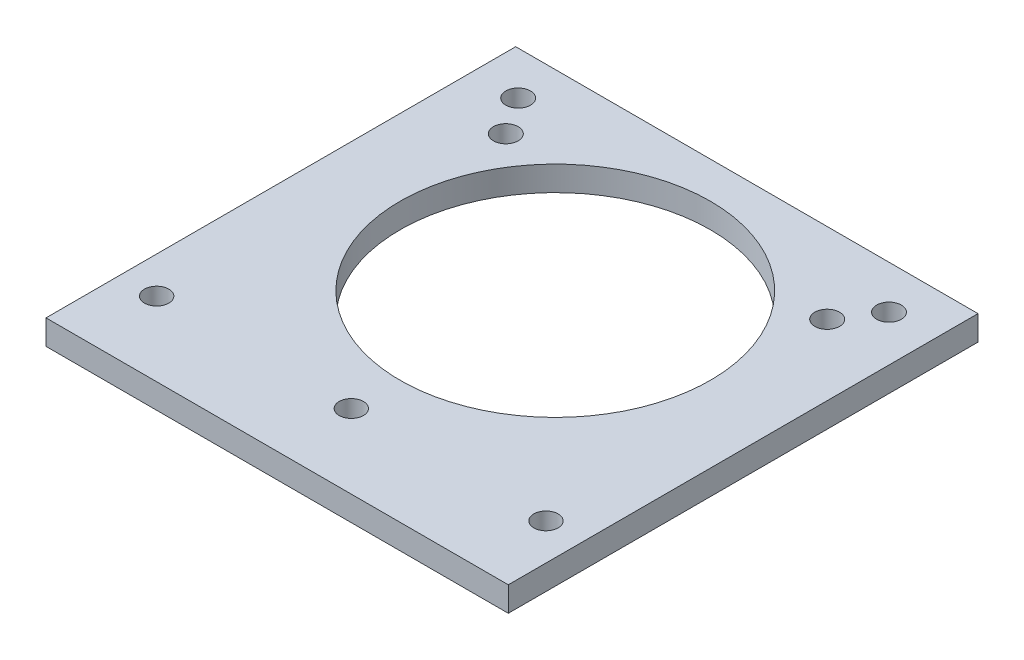
ISO-10303-21;
HEADER;
FILE_DESCRIPTION(('STEP AP214'),'2;1');
FILE_NAME('part.step','',(''),(''),'','','');
FILE_SCHEMA(('AUTOMOTIVE_DESIGN { 1 0 10303 214 1 1 1 1 }'));
ENDSEC;
DATA;
#1=APPLICATION_CONTEXT('core data for automotive mechanical design processes');
#2=APPLICATION_PROTOCOL_DEFINITION('international standard','automotive_design',2000,#1);
#3=PRODUCT_CONTEXT('',#1,'mechanical');
#4=PRODUCT('Part','Part','',(#3));
#5=PRODUCT_RELATED_PRODUCT_CATEGORY('part','',(#4));
#6=PRODUCT_DEFINITION_FORMATION('','',#4);
#7=PRODUCT_DEFINITION_CONTEXT('part definition',#1,'design');
#8=PRODUCT_DEFINITION('design','',#6,#7);
#9=PRODUCT_DEFINITION_SHAPE('','',#8);
#10=(LENGTH_UNIT() NAMED_UNIT(*) SI_UNIT(.MILLI.,.METRE.));
#11=(NAMED_UNIT(*) PLANE_ANGLE_UNIT() SI_UNIT($,.RADIAN.));
#12=(NAMED_UNIT(*) SI_UNIT($,.STERADIAN.) SOLID_ANGLE_UNIT());
#13=UNCERTAINTY_MEASURE_WITH_UNIT(LENGTH_MEASURE(1.E-05),#10,'distance_accuracy_value','');
#14=(GEOMETRIC_REPRESENTATION_CONTEXT(3) GLOBAL_UNCERTAINTY_ASSIGNED_CONTEXT((#13)) GLOBAL_UNIT_ASSIGNED_CONTEXT((#10,
#11,#12)) REPRESENTATION_CONTEXT('',''));
#15=CARTESIAN_POINT('',(0.,0.,0.));
#16=DIRECTION('',(0.,0.,1.));
#17=DIRECTION('',(1.,0.,0.));
#18=AXIS2_PLACEMENT_3D('',#15,#16,#17);
#19=CARTESIAN_POINT('',(-47.5,5.08,35.56));
#20=DIRECTION('',(0.,0.,-1.));
#21=DIRECTION('',(1.,0.,0.));
#22=AXIS2_PLACEMENT_3D('',#19,#20,#21);
#23=PLANE('',#22);
#24=DIRECTION('',(-1.,0.,0.));
#25=VECTOR('',#24,1.);
#26=CARTESIAN_POINT('',(-47.5,0.,35.56));
#27=LINE('',#26,#25);
#28=CARTESIAN_POINT('',(47.5,0.,35.56));
#29=VERTEX_POINT('',#28);
#30=CARTESIAN_POINT('',(-47.5,0.,35.56));
#31=VERTEX_POINT('',#30);
#32=EDGE_CURVE('E110',#29,#31,#27,.T.);
#33=ORIENTED_EDGE('',*,*,#32,.F.);
#34=DIRECTION('',(0.,-1.,0.));
#35=VECTOR('',#34,1.);
#36=CARTESIAN_POINT('',(47.5,5.08,35.56));
#37=LINE('',#36,#35);
#38=CARTESIAN_POINT('',(47.5,5.08,35.56));
#39=VERTEX_POINT('',#38);
#40=EDGE_CURVE('E109',#39,#29,#37,.T.);
#41=ORIENTED_EDGE('',*,*,#40,.F.);
#42=DIRECTION('',(-1.,0.,0.));
#43=VECTOR('',#42,1.);
#44=CARTESIAN_POINT('',(-47.5,5.08,35.56));
#45=LINE('',#44,#43);
#46=CARTESIAN_POINT('',(-47.5,5.08,35.56));
#47=VERTEX_POINT('',#46);
#48=EDGE_CURVE('E103',#39,#47,#45,.T.);
#49=ORIENTED_EDGE('',*,*,#48,.T.);
#50=DIRECTION('',(0.,-1.,0.));
#51=VECTOR('',#50,1.);
#52=CARTESIAN_POINT('',(-47.5,5.08,35.56));
#53=LINE('',#52,#51);
#54=EDGE_CURVE('E11',#47,#31,#53,.T.);
#55=ORIENTED_EDGE('',*,*,#54,.T.);
#56=EDGE_LOOP('',(#33,#41,#49,#55));
#57=FACE_BOUND('',#56,.T.);
#58=ADVANCED_FACE('F43',(#57),#23,.F.);
#59=CARTESIAN_POINT('',(-47.5,5.08,-60.96));
#60=DIRECTION('',(1.,0.,0.));
#61=DIRECTION('',(0.,0.,1.));
#62=AXIS2_PLACEMENT_3D('',#59,#60,#61);
#63=PLANE('',#62);
#64=DIRECTION('',(0.,0.,-1.));
#65=VECTOR('',#64,1.);
#66=CARTESIAN_POINT('',(-47.5,0.,-60.96));
#67=LINE('',#66,#65);
#68=CARTESIAN_POINT('',(-47.5,0.,-60.96));
#69=VERTEX_POINT('',#68);
#70=EDGE_CURVE('E112',#31,#69,#67,.T.);
#71=ORIENTED_EDGE('',*,*,#70,.F.);
#72=ORIENTED_EDGE('',*,*,#54,.F.);
#73=DIRECTION('',(0.,0.,-1.));
#74=VECTOR('',#73,1.);
#75=CARTESIAN_POINT('',(-47.5,5.08,-60.96));
#76=LINE('',#75,#74);
#77=CARTESIAN_POINT('',(-47.5,5.08,-60.96));
#78=VERTEX_POINT('',#77);
#79=EDGE_CURVE('E86',#47,#78,#76,.T.);
#80=ORIENTED_EDGE('',*,*,#79,.T.);
#81=DIRECTION('',(0.,-1.,0.));
#82=VECTOR('',#81,1.);
#83=CARTESIAN_POINT('',(-47.5,5.08,-60.96));
#84=LINE('',#83,#82);
#85=EDGE_CURVE('E52',#78,#69,#84,.T.);
#86=ORIENTED_EDGE('',*,*,#85,.T.);
#87=EDGE_LOOP('',(#71,#72,#80,#86));
#88=FACE_BOUND('',#87,.T.);
#89=ADVANCED_FACE('F101',(#88),#63,.F.);
#90=CARTESIAN_POINT('',(-47.5,5.08,-60.96));
#91=DIRECTION('',(0.,0.,1.));
#92=DIRECTION('',(-1.,0.,0.));
#93=AXIS2_PLACEMENT_3D('',#90,#91,#92);
#94=PLANE('',#93);
#95=DIRECTION('',(1.,0.,0.));
#96=VECTOR('',#95,1.);
#97=CARTESIAN_POINT('',(-47.5,0.,-60.96));
#98=LINE('',#97,#96);
#99=CARTESIAN_POINT('',(47.5,0.,-60.96));
#100=VERTEX_POINT('',#99);
#101=EDGE_CURVE('E96',#69,#100,#98,.T.);
#102=ORIENTED_EDGE('',*,*,#101,.F.);
#103=ORIENTED_EDGE('',*,*,#85,.F.);
#104=DIRECTION('',(1.,0.,0.));
#105=VECTOR('',#104,1.);
#106=CARTESIAN_POINT('',(-47.5,5.08,-60.96));
#107=LINE('',#106,#105);
#108=CARTESIAN_POINT('',(47.5,5.08,-60.96));
#109=VERTEX_POINT('',#108);
#110=EDGE_CURVE('E89',#78,#109,#107,.T.);
#111=ORIENTED_EDGE('',*,*,#110,.T.);
#112=DIRECTION('',(0.,-1.,0.));
#113=VECTOR('',#112,1.);
#114=CARTESIAN_POINT('',(47.5,5.08,-60.96));
#115=LINE('',#114,#113);
#116=EDGE_CURVE('E99',#109,#100,#115,.T.);
#117=ORIENTED_EDGE('',*,*,#116,.T.);
#118=EDGE_LOOP('',(#102,#103,#111,#117));
#119=FACE_BOUND('',#118,.T.);
#120=ADVANCED_FACE('F95',(#119),#94,.F.);
#121=CARTESIAN_POINT('',(47.5,5.08,-60.96));
#122=DIRECTION('',(-1.,0.,0.));
#123=DIRECTION('',(0.,0.,-1.));
#124=AXIS2_PLACEMENT_3D('',#121,#122,#123);
#125=PLANE('',#124);
#126=DIRECTION('',(0.,0.,1.));
#127=VECTOR('',#126,1.);
#128=CARTESIAN_POINT('',(47.5,0.,-60.96));
#129=LINE('',#128,#127);
#130=EDGE_CURVE('E75',#100,#29,#129,.T.);
#131=ORIENTED_EDGE('',*,*,#130,.F.);
#132=ORIENTED_EDGE('',*,*,#116,.F.);
#133=DIRECTION('',(0.,0.,1.));
#134=VECTOR('',#133,1.);
#135=CARTESIAN_POINT('',(47.5,5.08,-60.96));
#136=LINE('',#135,#134);
#137=EDGE_CURVE('E61',#109,#39,#136,.T.);
#138=ORIENTED_EDGE('',*,*,#137,.T.);
#139=ORIENTED_EDGE('',*,*,#40,.T.);
#140=EDGE_LOOP('',(#131,#132,#138,#139));
#141=FACE_BOUND('',#140,.T.);
#142=ADVANCED_FACE('F184',(#141),#125,.F.);
#143=CARTESIAN_POINT('',(0.,5.08,0.));
#144=DIRECTION('',(0.,1.,0.));
#145=DIRECTION('',(0.,0.,-1.));
#146=AXIS2_PLACEMENT_3D('',#143,#144,#145);
#147=PLANE('',#146);
#148=CARTESIAN_POINT('',(33.02,5.08,-44.45));
#149=DIRECTION('',(0.,-1.,0.));
#150=DIRECTION('',(0.,0.,1.));
#151=AXIS2_PLACEMENT_3D('',#148,#149,#150);
#152=CIRCLE('',#151,2.54);
#153=CARTESIAN_POINT('',(33.02,5.08,-41.91));
#154=VERTEX_POINT('',#153);
#155=EDGE_CURVE('E295',#154,#154,#152,.T.);
#156=ORIENTED_EDGE('',*,*,#155,.T.);
#157=EDGE_LOOP('',(#156));
#158=FACE_BOUND('',#157,.T.);
#159=CARTESIAN_POINT('',(-38.1,5.08,-52.07));
#160=DIRECTION('',(0.,-1.,0.));
#161=DIRECTION('',(0.,0.,-1.));
#162=AXIS2_PLACEMENT_3D('',#159,#160,#161);
#163=CIRCLE('',#162,2.54);
#164=CARTESIAN_POINT('',(-38.1,5.08,-54.61));
#165=VERTEX_POINT('',#164);
#166=EDGE_CURVE('E296',#165,#165,#163,.T.);
#167=ORIENTED_EDGE('',*,*,#166,.T.);
#168=EDGE_LOOP('',(#167));
#169=FACE_BOUND('',#168,.T.);
#170=CARTESIAN_POINT('',(38.1,5.08,-52.07));
#171=DIRECTION('',(0.,-1.,0.));
#172=DIRECTION('',(0.,0.,1.));
#173=AXIS2_PLACEMENT_3D('',#170,#171,#172);
#174=CIRCLE('',#173,2.54);
#175=CARTESIAN_POINT('',(38.1,5.08,-49.53));
#176=VERTEX_POINT('',#175);
#177=EDGE_CURVE('E300',#176,#176,#174,.T.);
#178=ORIENTED_EDGE('',*,*,#177,.T.);
#179=EDGE_LOOP('',(#178));
#180=FACE_BOUND('',#179,.T.);
#181=CARTESIAN_POINT('',(-33.02,5.08,-44.45));
#182=DIRECTION('',(0.,-1.,0.));
#183=DIRECTION('',(0.,0.,-1.));
#184=AXIS2_PLACEMENT_3D('',#181,#182,#183);
#185=CIRCLE('',#184,2.54);
#186=CARTESIAN_POINT('',(-33.02,5.08,-46.99));
#187=VERTEX_POINT('',#186);
#188=EDGE_CURVE('E123',#187,#187,#185,.T.);
#189=ORIENTED_EDGE('',*,*,#188,.T.);
#190=EDGE_LOOP('',(#189));
#191=FACE_BOUND('',#190,.T.);
#192=CARTESIAN_POINT('',(-40.,5.08,20.32));
#193=DIRECTION('',(0.,-1.,0.));
#194=DIRECTION('',(0.,0.,-1.));
#195=AXIS2_PLACEMENT_3D('',#192,#193,#194);
#196=CIRCLE('',#195,2.5);
#197=CARTESIAN_POINT('',(-40.,5.08,17.82));
#198=VERTEX_POINT('',#197);
#199=EDGE_CURVE('E130',#198,#198,#196,.T.);
#200=ORIENTED_EDGE('',*,*,#199,.T.);
#201=EDGE_LOOP('',(#200));
#202=FACE_BOUND('',#201,.T.);
#203=CARTESIAN_POINT('',(40.,5.08,20.32));
#204=DIRECTION('',(0.,-1.,0.));
#205=DIRECTION('',(0.,0.,-1.));
#206=AXIS2_PLACEMENT_3D('',#203,#204,#205);
#207=CIRCLE('',#206,2.5);
#208=CARTESIAN_POINT('',(40.,5.08,17.82));
#209=VERTEX_POINT('',#208);
#210=EDGE_CURVE('E139',#209,#209,#207,.T.);
#211=ORIENTED_EDGE('',*,*,#210,.T.);
#212=EDGE_LOOP('',(#211));
#213=FACE_BOUND('',#212,.T.);
#214=CARTESIAN_POINT('',(0.,5.08,20.32));
#215=DIRECTION('',(0.,-1.,0.));
#216=DIRECTION('',(0.,0.,-1.));
#217=AXIS2_PLACEMENT_3D('',#214,#215,#216);
#218=CIRCLE('',#217,2.5);
#219=CARTESIAN_POINT('',(0.,5.08,17.82));
#220=VERTEX_POINT('',#219);
#221=EDGE_CURVE('E149',#220,#220,#218,.T.);
#222=ORIENTED_EDGE('',*,*,#221,.T.);
#223=EDGE_LOOP('',(#222));
#224=FACE_BOUND('',#223,.T.);
#225=CARTESIAN_POINT('',(0.,5.08,-21.59));
#226=DIRECTION('',(0.,-1.,0.));
#227=DIRECTION('',(0.,0.,-1.));
#228=AXIS2_PLACEMENT_3D('',#225,#226,#227);
#229=CIRCLE('',#228,31.88);
#230=CARTESIAN_POINT('',(0.,5.08,-53.47));
#231=VERTEX_POINT('',#230);
#232=EDGE_CURVE('E155',#231,#231,#229,.T.);
#233=ORIENTED_EDGE('',*,*,#232,.T.);
#234=EDGE_LOOP('',(#233));
#235=FACE_BOUND('',#234,.T.);
#236=ORIENTED_EDGE('',*,*,#48,.F.);
#237=ORIENTED_EDGE('',*,*,#137,.F.);
#238=ORIENTED_EDGE('',*,*,#110,.F.);
#239=ORIENTED_EDGE('',*,*,#79,.F.);
#240=EDGE_LOOP('',(#236,#237,#238,#239));
#241=FACE_BOUND('',#240,.T.);
#242=ADVANCED_FACE('F91',(#158,#169,#180,#191,#202,#213,#224,#235,#241),#147,.T.);
#243=CARTESIAN_POINT('',(0.,0.,0.));
#244=DIRECTION('',(0.,1.,0.));
#245=DIRECTION('',(0.,0.,-1.));
#246=AXIS2_PLACEMENT_3D('',#243,#244,#245);
#247=PLANE('',#246);
#248=CARTESIAN_POINT('',(33.02,0.,-44.45));
#249=DIRECTION('',(0.,-1.,0.));
#250=DIRECTION('',(0.,0.,-1.));
#251=AXIS2_PLACEMENT_3D('',#248,#249,#250);
#252=CIRCLE('',#251,2.54);
#253=CARTESIAN_POINT('',(33.02,0.,-46.99));
#254=VERTEX_POINT('',#253);
#255=EDGE_CURVE('E46',#254,#254,#252,.T.);
#256=ORIENTED_EDGE('',*,*,#255,.F.);
#257=EDGE_LOOP('',(#256));
#258=FACE_BOUND('',#257,.T.);
#259=CARTESIAN_POINT('',(-38.1,0.,-52.07));
#260=DIRECTION('',(0.,-1.,0.));
#261=DIRECTION('',(0.,0.,-1.));
#262=AXIS2_PLACEMENT_3D('',#259,#260,#261);
#263=CIRCLE('',#262,2.54);
#264=CARTESIAN_POINT('',(-38.1,0.,-54.61));
#265=VERTEX_POINT('',#264);
#266=EDGE_CURVE('E125',#265,#265,#263,.T.);
#267=ORIENTED_EDGE('',*,*,#266,.F.);
#268=EDGE_LOOP('',(#267));
#269=FACE_BOUND('',#268,.T.);
#270=CARTESIAN_POINT('',(38.1,0.,-52.07));
#271=DIRECTION('',(0.,-1.,0.));
#272=DIRECTION('',(0.,0.,-1.));
#273=AXIS2_PLACEMENT_3D('',#270,#271,#272);
#274=CIRCLE('',#273,2.54);
#275=CARTESIAN_POINT('',(38.1,0.,-54.61));
#276=VERTEX_POINT('',#275);
#277=EDGE_CURVE('E122',#276,#276,#274,.T.);
#278=ORIENTED_EDGE('',*,*,#277,.F.);
#279=EDGE_LOOP('',(#278));
#280=FACE_BOUND('',#279,.T.);
#281=CARTESIAN_POINT('',(-33.02,0.,-44.45));
#282=DIRECTION('',(0.,-1.,0.));
#283=DIRECTION('',(0.,0.,-1.));
#284=AXIS2_PLACEMENT_3D('',#281,#282,#283);
#285=CIRCLE('',#284,2.54);
#286=CARTESIAN_POINT('',(-33.02,0.,-46.99));
#287=VERTEX_POINT('',#286);
#288=EDGE_CURVE('E119',#287,#287,#285,.T.);
#289=ORIENTED_EDGE('',*,*,#288,.F.);
#290=EDGE_LOOP('',(#289));
#291=FACE_BOUND('',#290,.T.);
#292=CARTESIAN_POINT('',(-40.,0.,20.32));
#293=DIRECTION('',(0.,-1.,0.));
#294=DIRECTION('',(0.,0.,-1.));
#295=AXIS2_PLACEMENT_3D('',#292,#293,#294);
#296=CIRCLE('',#295,2.5);
#297=CARTESIAN_POINT('',(-40.,0.,17.82));
#298=VERTEX_POINT('',#297);
#299=EDGE_CURVE('E134',#298,#298,#296,.T.);
#300=ORIENTED_EDGE('',*,*,#299,.F.);
#301=EDGE_LOOP('',(#300));
#302=FACE_BOUND('',#301,.T.);
#303=CARTESIAN_POINT('',(40.,0.,20.32));
#304=DIRECTION('',(0.,-1.,0.));
#305=DIRECTION('',(0.,0.,-1.));
#306=AXIS2_PLACEMENT_3D('',#303,#304,#305);
#307=CIRCLE('',#306,2.5);
#308=CARTESIAN_POINT('',(40.,0.,17.82));
#309=VERTEX_POINT('',#308);
#310=EDGE_CURVE('E146',#309,#309,#307,.T.);
#311=ORIENTED_EDGE('',*,*,#310,.F.);
#312=EDGE_LOOP('',(#311));
#313=FACE_BOUND('',#312,.T.);
#314=CARTESIAN_POINT('',(0.,0.,20.32));
#315=DIRECTION('',(0.,-1.,0.));
#316=DIRECTION('',(0.,0.,-1.));
#317=AXIS2_PLACEMENT_3D('',#314,#315,#316);
#318=CIRCLE('',#317,2.5);
#319=CARTESIAN_POINT('',(0.,0.,17.82));
#320=VERTEX_POINT('',#319);
#321=EDGE_CURVE('E152',#320,#320,#318,.T.);
#322=ORIENTED_EDGE('',*,*,#321,.F.);
#323=EDGE_LOOP('',(#322));
#324=FACE_BOUND('',#323,.T.);
#325=CARTESIAN_POINT('',(0.,0.,-21.59));
#326=DIRECTION('',(0.,-1.,0.));
#327=DIRECTION('',(0.,0.,-1.));
#328=AXIS2_PLACEMENT_3D('',#325,#326,#327);
#329=CIRCLE('',#328,31.88);
#330=CARTESIAN_POINT('',(0.,0.,-53.47));
#331=VERTEX_POINT('',#330);
#332=EDGE_CURVE('E113',#331,#331,#329,.T.);
#333=ORIENTED_EDGE('',*,*,#332,.F.);
#334=EDGE_LOOP('',(#333));
#335=FACE_BOUND('',#334,.T.);
#336=ORIENTED_EDGE('',*,*,#32,.T.);
#337=ORIENTED_EDGE('',*,*,#70,.T.);
#338=ORIENTED_EDGE('',*,*,#101,.T.);
#339=ORIENTED_EDGE('',*,*,#130,.T.);
#340=EDGE_LOOP('',(#336,#337,#338,#339));
#341=FACE_BOUND('',#340,.T.);
#342=ADVANCED_FACE('F164',(#258,#269,#280,#291,#302,#313,#324,#335,#341),#247,.F.);
#343=CARTESIAN_POINT('',(0.,0.,-21.59));
#344=DIRECTION('',(0.,1.,0.));
#345=DIRECTION('',(0.,0.,-1.));
#346=AXIS2_PLACEMENT_3D('',#343,#344,#345);
#347=CYLINDRICAL_SURFACE('',#346,31.88);
#348=ORIENTED_EDGE('',*,*,#332,.T.);
#349=EDGE_LOOP('',(#348));
#350=FACE_BOUND('',#349,.T.);
#351=ORIENTED_EDGE('',*,*,#232,.F.);
#352=EDGE_LOOP('',(#351));
#353=FACE_BOUND('',#352,.T.);
#354=ADVANCED_FACE('F161',(#350,#353),#347,.F.);
#355=CARTESIAN_POINT('',(0.,5.08,20.32));
#356=DIRECTION('',(0.,1.,0.));
#357=DIRECTION('',(0.,0.,-1.));
#358=AXIS2_PLACEMENT_3D('',#355,#356,#357);
#359=CYLINDRICAL_SURFACE('',#358,2.5);
#360=ORIENTED_EDGE('',*,*,#321,.T.);
#361=EDGE_LOOP('',(#360));
#362=FACE_BOUND('',#361,.T.);
#363=ORIENTED_EDGE('',*,*,#221,.F.);
#364=EDGE_LOOP('',(#363));
#365=FACE_BOUND('',#364,.T.);
#366=ADVANCED_FACE('F163',(#362,#365),#359,.F.);
#367=CARTESIAN_POINT('',(40.,5.08,20.32));
#368=DIRECTION('',(0.,1.,0.));
#369=DIRECTION('',(0.,0.,-1.));
#370=AXIS2_PLACEMENT_3D('',#367,#368,#369);
#371=CYLINDRICAL_SURFACE('',#370,2.5);
#372=ORIENTED_EDGE('',*,*,#310,.T.);
#373=EDGE_LOOP('',(#372));
#374=FACE_BOUND('',#373,.T.);
#375=ORIENTED_EDGE('',*,*,#210,.F.);
#376=EDGE_LOOP('',(#375));
#377=FACE_BOUND('',#376,.T.);
#378=ADVANCED_FACE('F171',(#374,#377),#371,.F.);
#379=CARTESIAN_POINT('',(-40.,5.08,20.32));
#380=DIRECTION('',(0.,1.,0.));
#381=DIRECTION('',(0.,0.,-1.));
#382=AXIS2_PLACEMENT_3D('',#379,#380,#381);
#383=CYLINDRICAL_SURFACE('',#382,2.5);
#384=ORIENTED_EDGE('',*,*,#299,.T.);
#385=EDGE_LOOP('',(#384));
#386=FACE_BOUND('',#385,.T.);
#387=ORIENTED_EDGE('',*,*,#199,.F.);
#388=EDGE_LOOP('',(#387));
#389=FACE_BOUND('',#388,.T.);
#390=ADVANCED_FACE('F240',(#386,#389),#383,.F.);
#391=CARTESIAN_POINT('',(-33.02,-2.54,-44.45));
#392=DIRECTION('',(0.,1.,0.));
#393=DIRECTION('',(0.,0.,-1.));
#394=AXIS2_PLACEMENT_3D('',#391,#392,#393);
#395=CYLINDRICAL_SURFACE('',#394,2.54);
#396=ORIENTED_EDGE('',*,*,#188,.F.);
#397=EDGE_LOOP('',(#396));
#398=FACE_BOUND('',#397,.T.);
#399=ORIENTED_EDGE('',*,*,#288,.T.);
#400=EDGE_LOOP('',(#399));
#401=FACE_BOUND('',#400,.T.);
#402=ADVANCED_FACE('F250',(#398,#401),#395,.F.);
#403=CARTESIAN_POINT('',(38.1,-2.54,-52.07));
#404=DIRECTION('',(0.,1.,0.));
#405=DIRECTION('',(0.,0.,-1.));
#406=AXIS2_PLACEMENT_3D('',#403,#404,#405);
#407=CYLINDRICAL_SURFACE('',#406,2.54);
#408=ORIENTED_EDGE('',*,*,#177,.F.);
#409=EDGE_LOOP('',(#408));
#410=FACE_BOUND('',#409,.T.);
#411=ORIENTED_EDGE('',*,*,#277,.T.);
#412=EDGE_LOOP('',(#411));
#413=FACE_BOUND('',#412,.T.);
#414=ADVANCED_FACE('F260',(#410,#413),#407,.F.);
#415=CARTESIAN_POINT('',(-38.1,-2.54,-52.07));
#416=DIRECTION('',(0.,1.,0.));
#417=DIRECTION('',(0.,0.,-1.));
#418=AXIS2_PLACEMENT_3D('',#415,#416,#417);
#419=CYLINDRICAL_SURFACE('',#418,2.54);
#420=ORIENTED_EDGE('',*,*,#166,.F.);
#421=EDGE_LOOP('',(#420));
#422=FACE_BOUND('',#421,.T.);
#423=ORIENTED_EDGE('',*,*,#266,.T.);
#424=EDGE_LOOP('',(#423));
#425=FACE_BOUND('',#424,.T.);
#426=ADVANCED_FACE('F270',(#422,#425),#419,.F.);
#427=CARTESIAN_POINT('',(33.02,-2.54,-44.45));
#428=DIRECTION('',(0.,1.,0.));
#429=DIRECTION('',(0.,0.,-1.));
#430=AXIS2_PLACEMENT_3D('',#427,#428,#429);
#431=CYLINDRICAL_SURFACE('',#430,2.54);
#432=ORIENTED_EDGE('',*,*,#155,.F.);
#433=EDGE_LOOP('',(#432));
#434=FACE_BOUND('',#433,.T.);
#435=ORIENTED_EDGE('',*,*,#255,.T.);
#436=EDGE_LOOP('',(#435));
#437=FACE_BOUND('',#436,.T.);
#438=ADVANCED_FACE('F280',(#434,#437),#431,.F.);
#439=CLOSED_SHELL('',(#58,#89,#120,#142,#242,#342,#354,#366,#378,#390,#402,#414,#426,#438));
#440=MANIFOLD_SOLID_BREP('B2',#439);
#441=ADVANCED_BREP_SHAPE_REPRESENTATION('',(#18,#440),#14);
#442=SHAPE_DEFINITION_REPRESENTATION(#9,#441);
ENDSEC;
END-ISO-10303-21;
